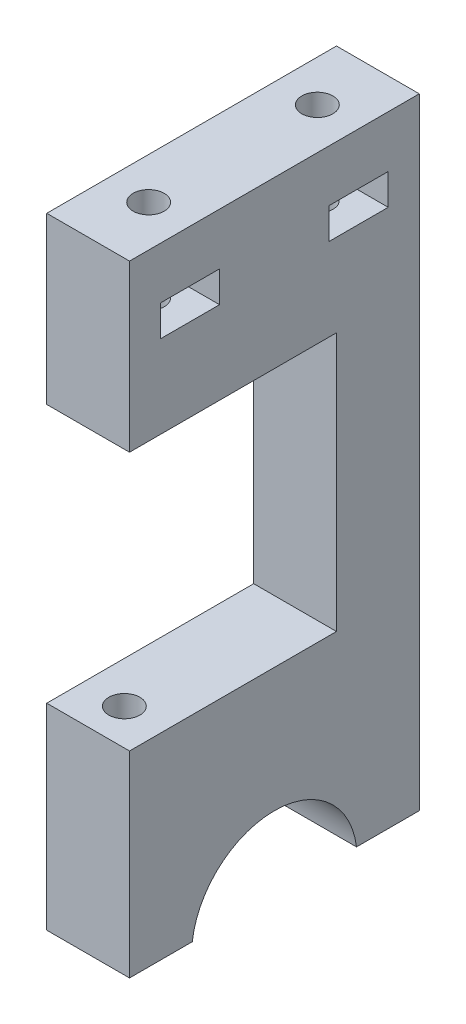
ISO-10303-21;
HEADER;
FILE_DESCRIPTION(('STEP AP214'),'2;1');
FILE_NAME('part.step','',(''),(''),'','','');
FILE_SCHEMA(('AUTOMOTIVE_DESIGN { 1 0 10303 214 1 1 1 1 }'));
ENDSEC;
DATA;
#1=APPLICATION_CONTEXT('core data for automotive mechanical design processes');
#2=APPLICATION_PROTOCOL_DEFINITION('international standard','automotive_design',2000,#1);
#3=PRODUCT_CONTEXT('',#1,'mechanical');
#4=PRODUCT('Part','Part','',(#3));
#5=PRODUCT_RELATED_PRODUCT_CATEGORY('part','',(#4));
#6=PRODUCT_DEFINITION_FORMATION('','',#4);
#7=PRODUCT_DEFINITION_CONTEXT('part definition',#1,'design');
#8=PRODUCT_DEFINITION('design','',#6,#7);
#9=PRODUCT_DEFINITION_SHAPE('','',#8);
#10=(LENGTH_UNIT() NAMED_UNIT(*) SI_UNIT(.MILLI.,.METRE.));
#11=(NAMED_UNIT(*) PLANE_ANGLE_UNIT() SI_UNIT($,.RADIAN.));
#12=(NAMED_UNIT(*) SI_UNIT($,.STERADIAN.) SOLID_ANGLE_UNIT());
#13=UNCERTAINTY_MEASURE_WITH_UNIT(LENGTH_MEASURE(1.E-05),#10,'distance_accuracy_value','');
#14=(GEOMETRIC_REPRESENTATION_CONTEXT(3) GLOBAL_UNCERTAINTY_ASSIGNED_CONTEXT((#13)) GLOBAL_UNIT_ASSIGNED_CONTEXT((#10,
#11,#12)) REPRESENTATION_CONTEXT('',''));
#15=CARTESIAN_POINT('',(0.,0.,0.));
#16=DIRECTION('',(0.,0.,1.));
#17=DIRECTION('',(1.,0.,0.));
#18=AXIS2_PLACEMENT_3D('',#15,#16,#17);
#19=CARTESIAN_POINT('',(1.99999999999999,60.,6.15044247787611));
#20=DIRECTION('',(0.,0.,-1.));
#21=DIRECTION('',(-1.,0.,0.));
#22=AXIS2_PLACEMENT_3D('',#19,#20,#21);
#23=PLANE('',#22);
#24=DIRECTION('',(0.,-1.,0.));
#25=VECTOR('',#24,1.);
#26=CARTESIAN_POINT('',(1.99999999999999,60.,6.15044247787611));
#27=LINE('',#26,#25);
#28=CARTESIAN_POINT('',(1.99999999999999,60.,6.15044247787611));
#29=VERTEX_POINT('',#28);
#30=CARTESIAN_POINT('',(1.99999999999999,44.,6.15044247787611));
#31=VERTEX_POINT('',#30);
#32=EDGE_CURVE('E11',#29,#31,#27,.T.);
#33=ORIENTED_EDGE('',*,*,#32,.T.);
#34=DIRECTION('',(1.,0.,0.));
#35=VECTOR('',#34,1.);
#36=CARTESIAN_POINT('',(1.99999999999999,44.,6.15044247787611));
#37=LINE('',#36,#35);
#38=CARTESIAN_POINT('',(9.99999999999999,44.,6.15044247787611));
#39=VERTEX_POINT('',#38);
#40=EDGE_CURVE('E198',#31,#39,#37,.T.);
#41=ORIENTED_EDGE('',*,*,#40,.T.);
#42=DIRECTION('',(0.,-1.,0.));
#43=VECTOR('',#42,1.);
#44=CARTESIAN_POINT('',(9.99999999999999,60.,6.15044247787611));
#45=LINE('',#44,#43);
#46=CARTESIAN_POINT('',(9.99999999999999,60.,6.15044247787611));
#47=VERTEX_POINT('',#46);
#48=EDGE_CURVE('E182',#47,#39,#45,.T.);
#49=ORIENTED_EDGE('',*,*,#48,.F.);
#50=DIRECTION('',(1.,0.,0.));
#51=VECTOR('',#50,1.);
#52=CARTESIAN_POINT('',(1.99999999999999,60.,6.15044247787611));
#53=LINE('',#52,#51);
#54=EDGE_CURVE('E306',#29,#47,#53,.T.);
#55=ORIENTED_EDGE('',*,*,#54,.F.);
#56=EDGE_LOOP('',(#33,#41,#49,#55));
#57=FACE_BOUND('',#56,.T.);
#58=ADVANCED_FACE('F33',(#57),#23,.F.);
#59=CARTESIAN_POINT('',(0.,0.,0.));
#60=DIRECTION('',(0.,1.,0.));
#61=DIRECTION('',(0.,0.,1.));
#62=AXIS2_PLACEMENT_3D('',#59,#60,#61);
#63=PLANE('',#62);
#64=CARTESIAN_POINT('',(5.99999999999999,0.,2.65044247787611));
#65=DIRECTION('',(0.,-1.,0.));
#66=DIRECTION('',(0.,0.,-1.));
#67=AXIS2_PLACEMENT_3D('',#64,#65,#66);
#68=CIRCLE('',#67,1.5);
#69=CARTESIAN_POINT('',(5.99999999999999,0.,1.15044247787611));
#70=VERTEX_POINT('',#69);
#71=EDGE_CURVE('E279',#70,#70,#68,.T.);
#72=ORIENTED_EDGE('',*,*,#71,.F.);
#73=EDGE_LOOP('',(#72));
#74=FACE_BOUND('',#73,.T.);
#75=DIRECTION('',(0.,0.,1.));
#76=VECTOR('',#75,1.);
#77=CARTESIAN_POINT('',(1.99999999999999,0.,-21.8495575221239));
#78=LINE('',#77,#76);
#79=CARTESIAN_POINT('',(1.99999999999999,0.,0.0876964110698811));
#80=VERTEX_POINT('',#79);
#81=CARTESIAN_POINT('',(1.99999999999999,0.,6.15044247787611));
#82=VERTEX_POINT('',#81);
#83=EDGE_CURVE('E180',#80,#82,#78,.T.);
#84=ORIENTED_EDGE('',*,*,#83,.F.);
#85=DIRECTION('',(1.,0.,0.));
#86=VECTOR('',#85,1.);
#87=CARTESIAN_POINT('',(1.99999999999999,0.,0.0876964110698811));
#88=LINE('',#87,#86);
#89=CARTESIAN_POINT('',(9.99999999999999,0.,0.0876964110698806));
#90=VERTEX_POINT('',#89);
#91=EDGE_CURVE('E297',#80,#90,#88,.T.);
#92=ORIENTED_EDGE('',*,*,#91,.T.);
#93=DIRECTION('',(0.,0.,-1.));
#94=VECTOR('',#93,1.);
#95=CARTESIAN_POINT('',(9.99999999999999,0.,-21.8495575221239));
#96=LINE('',#95,#94);
#97=CARTESIAN_POINT('',(9.99999999999999,0.,6.15044247787611));
#98=VERTEX_POINT('',#97);
#99=EDGE_CURVE('E320',#98,#90,#96,.T.);
#100=ORIENTED_EDGE('',*,*,#99,.F.);
#101=DIRECTION('',(1.,0.,0.));
#102=VECTOR('',#101,1.);
#103=CARTESIAN_POINT('',(1.99999999999999,0.,6.15044247787611));
#104=LINE('',#103,#102);
#105=EDGE_CURVE('E317',#82,#98,#104,.T.);
#106=ORIENTED_EDGE('',*,*,#105,.F.);
#107=EDGE_LOOP('',(#84,#92,#100,#106));
#108=FACE_BOUND('',#107,.T.);
#109=ADVANCED_FACE('F338',(#74,#108),#63,.F.);
#110=CARTESIAN_POINT('',(1.99999999999999,60.,-21.8495575221239));
#111=DIRECTION('',(1.,0.,0.));
#112=DIRECTION('',(0.,0.,-1.));
#113=AXIS2_PLACEMENT_3D('',#110,#111,#112);
#114=PLANE('',#113);
#115=DIRECTION('',(0.,0.,1.));
#116=VECTOR('',#115,1.);
#117=CARTESIAN_POINT('',(1.99999999999999,52.,-2.54955752212389));
#118=LINE('',#117,#116);
#119=CARTESIAN_POINT('',(1.99999999999999,52.,-2.54955752212389));
#120=VERTEX_POINT('',#119);
#121=CARTESIAN_POINT('',(1.99999999999999,52.,3.15044247787611));
#122=VERTEX_POINT('',#121);
#123=EDGE_CURVE('E238',#120,#122,#118,.T.);
#124=ORIENTED_EDGE('',*,*,#123,.F.);
#125=DIRECTION('',(0.,-1.,0.));
#126=VECTOR('',#125,1.);
#127=CARTESIAN_POINT('',(1.99999999999999,52.,-2.54955752212389));
#128=LINE('',#127,#126);
#129=CARTESIAN_POINT('',(1.99999999999999,55.,-2.54955752212389));
#130=VERTEX_POINT('',#129);
#131=EDGE_CURVE('E58',#130,#120,#128,.T.);
#132=ORIENTED_EDGE('',*,*,#131,.F.);
#133=DIRECTION('',(0.,0.,-1.));
#134=VECTOR('',#133,1.);
#135=CARTESIAN_POINT('',(1.99999999999999,55.,-2.54955752212389));
#136=LINE('',#135,#134);
#137=CARTESIAN_POINT('',(1.99999999999999,55.,3.15044247787611));
#138=VERTEX_POINT('',#137);
#139=EDGE_CURVE('E227',#138,#130,#136,.T.);
#140=ORIENTED_EDGE('',*,*,#139,.F.);
#141=DIRECTION('',(0.,1.,0.));
#142=VECTOR('',#141,1.);
#143=CARTESIAN_POINT('',(1.99999999999999,52.,3.15044247787611));
#144=LINE('',#143,#142);
#145=EDGE_CURVE('E241',#122,#138,#144,.T.);
#146=ORIENTED_EDGE('',*,*,#145,.F.);
#147=EDGE_LOOP('',(#124,#132,#140,#146));
#148=FACE_BOUND('',#147,.T.);
#149=DIRECTION('',(0.,0.,1.));
#150=VECTOR('',#149,1.);
#151=CARTESIAN_POINT('',(1.99999999999999,52.,-18.8495575221239));
#152=LINE('',#151,#150);
#153=CARTESIAN_POINT('',(1.99999999999999,52.,-18.8495575221239));
#154=VERTEX_POINT('',#153);
#155=CARTESIAN_POINT('',(1.99999999999999,52.,-13.1495575221239));
#156=VERTEX_POINT('',#155);
#157=EDGE_CURVE('E269',#154,#156,#152,.T.);
#158=ORIENTED_EDGE('',*,*,#157,.F.);
#159=DIRECTION('',(0.,-1.,0.));
#160=VECTOR('',#159,1.);
#161=CARTESIAN_POINT('',(1.99999999999999,52.,-18.8495575221239));
#162=LINE('',#161,#160);
#163=CARTESIAN_POINT('',(1.99999999999999,55.,-18.8495575221239));
#164=VERTEX_POINT('',#163);
#165=EDGE_CURVE('E248',#164,#154,#162,.T.);
#166=ORIENTED_EDGE('',*,*,#165,.F.);
#167=DIRECTION('',(0.,0.,-1.));
#168=VECTOR('',#167,1.);
#169=CARTESIAN_POINT('',(1.99999999999999,55.,-18.8495575221239));
#170=LINE('',#169,#168);
#171=CARTESIAN_POINT('',(1.99999999999999,55.,-13.1495575221239));
#172=VERTEX_POINT('',#171);
#173=EDGE_CURVE('E258',#172,#164,#170,.T.);
#174=ORIENTED_EDGE('',*,*,#173,.F.);
#175=DIRECTION('',(0.,1.,0.));
#176=VECTOR('',#175,1.);
#177=CARTESIAN_POINT('',(1.99999999999999,52.,-13.1495575221239));
#178=LINE('',#177,#176);
#179=EDGE_CURVE('E272',#156,#172,#178,.T.);
#180=ORIENTED_EDGE('',*,*,#179,.F.);
#181=EDGE_LOOP('',(#158,#166,#174,#180));
#182=FACE_BOUND('',#181,.T.);
#183=DIRECTION('',(0.,1.,0.));
#184=VECTOR('',#183,1.);
#185=CARTESIAN_POINT('',(1.99999999999999,44.,-13.8495575221239));
#186=LINE('',#185,#184);
#187=CARTESIAN_POINT('',(1.99999999999999,19.,-13.8495575221239));
#188=VERTEX_POINT('',#187);
#189=CARTESIAN_POINT('',(1.99999999999999,44.,-13.8495575221239));
#190=VERTEX_POINT('',#189);
#191=EDGE_CURVE('E167',#188,#190,#186,.T.);
#192=ORIENTED_EDGE('',*,*,#191,.T.);
#193=DIRECTION('',(0.,0.,1.));
#194=VECTOR('',#193,1.);
#195=CARTESIAN_POINT('',(1.99999999999999,44.,6.15044247787611));
#196=LINE('',#195,#194);
#197=EDGE_CURVE('E176',#190,#31,#196,.T.);
#198=ORIENTED_EDGE('',*,*,#197,.T.);
#199=ORIENTED_EDGE('',*,*,#32,.F.);
#200=DIRECTION('',(0.,0.,1.));
#201=VECTOR('',#200,1.);
#202=CARTESIAN_POINT('',(1.99999999999999,60.,-21.8495575221239));
#203=LINE('',#202,#201);
#204=CARTESIAN_POINT('',(1.99999999999999,60.,-21.8495575221239));
#205=VERTEX_POINT('',#204);
#206=EDGE_CURVE('E303',#205,#29,#203,.T.);
#207=ORIENTED_EDGE('',*,*,#206,.F.);
#208=DIRECTION('',(0.,-1.,0.));
#209=VECTOR('',#208,1.);
#210=CARTESIAN_POINT('',(1.99999999999999,60.,-21.8495575221239));
#211=LINE('',#210,#209);
#212=CARTESIAN_POINT('',(1.99999999999999,0.,-21.8495575221239));
#213=VERTEX_POINT('',#212);
#214=EDGE_CURVE('E313',#205,#213,#211,.T.);
#215=ORIENTED_EDGE('',*,*,#214,.T.);
#216=CARTESIAN_POINT('',(1.99999999999999,0.,-15.7868114553177));
#217=VERTEX_POINT('',#216);
#218=EDGE_CURVE('E314',#213,#217,#78,.T.);
#219=ORIENTED_EDGE('',*,*,#218,.T.);
#220=CARTESIAN_POINT('',(1.99999999999999,-1.,-7.84955752212389));
#221=DIRECTION('',(1.,0.,0.));
#222=DIRECTION('',(0.,0.,-1.));
#223=AXIS2_PLACEMENT_3D('',#220,#221,#222);
#224=CIRCLE('',#223,8.);
#225=EDGE_CURVE('E295',#217,#80,#224,.T.);
#226=ORIENTED_EDGE('',*,*,#225,.T.);
#227=ORIENTED_EDGE('',*,*,#83,.T.);
#228=CARTESIAN_POINT('',(1.99999999999999,19.,6.1504424778761));
#229=VERTEX_POINT('',#228);
#230=EDGE_CURVE('E42',#229,#82,#27,.T.);
#231=ORIENTED_EDGE('',*,*,#230,.F.);
#232=DIRECTION('',(0.,0.,-1.));
#233=VECTOR('',#232,1.);
#234=CARTESIAN_POINT('',(1.99999999999999,19.,6.1504424778761));
#235=LINE('',#234,#233);
#236=EDGE_CURVE('E159',#229,#188,#235,.T.);
#237=ORIENTED_EDGE('',*,*,#236,.T.);
#238=EDGE_LOOP('',(#192,#198,#199,#207,#215,#219,#226,#227,#231,#237));
#239=FACE_BOUND('',#238,.T.);
#240=ADVANCED_FACE('F35',(#148,#182,#239),#114,.F.);
#241=CARTESIAN_POINT('',(9.99999999999999,19.,6.15044247787611));
#242=VERTEX_POINT('',#241);
#243=EDGE_CURVE('E175',#242,#98,#45,.T.);
#244=ORIENTED_EDGE('',*,*,#243,.F.);
#245=DIRECTION('',(1.,0.,0.));
#246=VECTOR('',#245,1.);
#247=CARTESIAN_POINT('',(1.99999999999999,19.,6.1504424778761));
#248=LINE('',#247,#246);
#249=EDGE_CURVE('E50',#229,#242,#248,.T.);
#250=ORIENTED_EDGE('',*,*,#249,.F.);
#251=ORIENTED_EDGE('',*,*,#230,.T.);
#252=ORIENTED_EDGE('',*,*,#105,.T.);
#253=EDGE_LOOP('',(#244,#250,#251,#252));
#254=FACE_BOUND('',#253,.T.);
#255=ADVANCED_FACE('F172',(#254),#23,.F.);
#256=CARTESIAN_POINT('',(9.99999999999999,60.,-21.8495575221239));
#257=DIRECTION('',(-1.,0.,0.));
#258=DIRECTION('',(0.,0.,1.));
#259=AXIS2_PLACEMENT_3D('',#256,#257,#258);
#260=PLANE('',#259);
#261=DIRECTION('',(0.,0.,-1.));
#262=VECTOR('',#261,1.);
#263=CARTESIAN_POINT('',(10.,55.,-2.5495575221239));
#264=LINE('',#263,#262);
#265=CARTESIAN_POINT('',(10.,55.,3.1504424778761));
#266=VERTEX_POINT('',#265);
#267=CARTESIAN_POINT('',(10.,55.,-2.5495575221239));
#268=VERTEX_POINT('',#267);
#269=EDGE_CURVE('E233',#266,#268,#264,.T.);
#270=ORIENTED_EDGE('',*,*,#269,.T.);
#271=DIRECTION('',(0.,-1.,0.));
#272=VECTOR('',#271,1.);
#273=CARTESIAN_POINT('',(10.,52.,-2.5495575221239));
#274=LINE('',#273,#272);
#275=CARTESIAN_POINT('',(10.,52.,-2.5495575221239));
#276=VERTEX_POINT('',#275);
#277=EDGE_CURVE('E223',#268,#276,#274,.T.);
#278=ORIENTED_EDGE('',*,*,#277,.T.);
#279=DIRECTION('',(0.,0.,1.));
#280=VECTOR('',#279,1.);
#281=CARTESIAN_POINT('',(10.,52.,-2.5495575221239));
#282=LINE('',#281,#280);
#283=CARTESIAN_POINT('',(9.99999999999999,52.,3.15044247787611));
#284=VERTEX_POINT('',#283);
#285=EDGE_CURVE('E226',#276,#284,#282,.T.);
#286=ORIENTED_EDGE('',*,*,#285,.T.);
#287=DIRECTION('',(0.,1.,0.));
#288=VECTOR('',#287,1.);
#289=CARTESIAN_POINT('',(10.,52.,3.1504424778761));
#290=LINE('',#289,#288);
#291=EDGE_CURVE('E230',#284,#266,#290,.T.);
#292=ORIENTED_EDGE('',*,*,#291,.T.);
#293=EDGE_LOOP('',(#270,#278,#286,#292));
#294=FACE_BOUND('',#293,.T.);
#295=DIRECTION('',(0.,0.,-1.));
#296=VECTOR('',#295,1.);
#297=CARTESIAN_POINT('',(9.99999999999999,55.,-18.8495575221239));
#298=LINE('',#297,#296);
#299=CARTESIAN_POINT('',(9.99999999999999,55.,-13.1495575221239));
#300=VERTEX_POINT('',#299);
#301=CARTESIAN_POINT('',(9.99999999999999,55.,-18.8495575221239));
#302=VERTEX_POINT('',#301);
#303=EDGE_CURVE('E264',#300,#302,#298,.T.);
#304=ORIENTED_EDGE('',*,*,#303,.T.);
#305=DIRECTION('',(0.,-1.,0.));
#306=VECTOR('',#305,1.);
#307=CARTESIAN_POINT('',(9.99999999999999,52.,-18.8495575221239));
#308=LINE('',#307,#306);
#309=CARTESIAN_POINT('',(9.99999999999999,52.,-18.8495575221239));
#310=VERTEX_POINT('',#309);
#311=EDGE_CURVE('E254',#302,#310,#308,.T.);
#312=ORIENTED_EDGE('',*,*,#311,.T.);
#313=DIRECTION('',(0.,0.,1.));
#314=VECTOR('',#313,1.);
#315=CARTESIAN_POINT('',(9.99999999999999,52.,-18.8495575221239));
#316=LINE('',#315,#314);
#317=CARTESIAN_POINT('',(9.99999999999999,52.,-13.1495575221239));
#318=VERTEX_POINT('',#317);
#319=EDGE_CURVE('E257',#310,#318,#316,.T.);
#320=ORIENTED_EDGE('',*,*,#319,.T.);
#321=DIRECTION('',(0.,1.,0.));
#322=VECTOR('',#321,1.);
#323=CARTESIAN_POINT('',(9.99999999999999,52.,-13.1495575221239));
#324=LINE('',#323,#322);
#325=EDGE_CURVE('E261',#318,#300,#324,.T.);
#326=ORIENTED_EDGE('',*,*,#325,.T.);
#327=EDGE_LOOP('',(#304,#312,#320,#326));
#328=FACE_BOUND('',#327,.T.);
#329=ORIENTED_EDGE('',*,*,#48,.T.);
#330=DIRECTION('',(0.,0.,1.));
#331=VECTOR('',#330,1.);
#332=CARTESIAN_POINT('',(9.99999999999999,44.,6.15044247787611));
#333=LINE('',#332,#331);
#334=CARTESIAN_POINT('',(9.99999999999999,44.,-13.8495575221239));
#335=VERTEX_POINT('',#334);
#336=EDGE_CURVE('E168',#335,#39,#333,.T.);
#337=ORIENTED_EDGE('',*,*,#336,.F.);
#338=DIRECTION('',(0.,1.,0.));
#339=VECTOR('',#338,1.);
#340=CARTESIAN_POINT('',(9.99999999999999,44.,-13.8495575221239));
#341=LINE('',#340,#339);
#342=CARTESIAN_POINT('',(9.99999999999999,19.,-13.8495575221239));
#343=VERTEX_POINT('',#342);
#344=EDGE_CURVE('E355',#343,#335,#341,.T.);
#345=ORIENTED_EDGE('',*,*,#344,.F.);
#346=DIRECTION('',(0.,0.,-1.));
#347=VECTOR('',#346,1.);
#348=CARTESIAN_POINT('',(9.99999999999999,19.,6.1504424778761));
#349=LINE('',#348,#347);
#350=EDGE_CURVE('E336',#242,#343,#349,.T.);
#351=ORIENTED_EDGE('',*,*,#350,.F.);
#352=ORIENTED_EDGE('',*,*,#243,.T.);
#353=ORIENTED_EDGE('',*,*,#99,.T.);
#354=CARTESIAN_POINT('',(9.99999999999999,-1.,-7.84955752212389));
#355=DIRECTION('',(1.,0.,0.));
#356=DIRECTION('',(0.,0.,-1.));
#357=AXIS2_PLACEMENT_3D('',#354,#355,#356);
#358=CIRCLE('',#357,8.);
#359=CARTESIAN_POINT('',(9.99999999999999,0.,-15.7868114553177));
#360=VERTEX_POINT('',#359);
#361=EDGE_CURVE('E292',#360,#90,#358,.T.);
#362=ORIENTED_EDGE('',*,*,#361,.F.);
#363=CARTESIAN_POINT('',(9.99999999999999,0.,-21.8495575221239));
#364=VERTEX_POINT('',#363);
#365=EDGE_CURVE('E319',#360,#364,#96,.T.);
#366=ORIENTED_EDGE('',*,*,#365,.T.);
#367=DIRECTION('',(0.,-1.,0.));
#368=VECTOR('',#367,1.);
#369=CARTESIAN_POINT('',(9.99999999999999,60.,-21.8495575221239));
#370=LINE('',#369,#368);
#371=CARTESIAN_POINT('',(9.99999999999999,60.,-21.8495575221239));
#372=VERTEX_POINT('',#371);
#373=EDGE_CURVE('E325',#372,#364,#370,.T.);
#374=ORIENTED_EDGE('',*,*,#373,.F.);
#375=DIRECTION('',(0.,0.,-1.));
#376=VECTOR('',#375,1.);
#377=CARTESIAN_POINT('',(9.99999999999999,60.,-21.8495575221239));
#378=LINE('',#377,#376);
#379=EDGE_CURVE('E309',#47,#372,#378,.T.);
#380=ORIENTED_EDGE('',*,*,#379,.F.);
#381=EDGE_LOOP('',(#329,#337,#345,#351,#352,#353,#362,#366,#374,#380));
#382=FACE_BOUND('',#381,.T.);
#383=ADVANCED_FACE('F332',(#294,#328,#382),#260,.F.);
#384=CARTESIAN_POINT('',(1.99999999999999,60.,-21.8495575221239));
#385=DIRECTION('',(0.,0.,1.));
#386=DIRECTION('',(1.,0.,0.));
#387=AXIS2_PLACEMENT_3D('',#384,#385,#386);
#388=PLANE('',#387);
#389=DIRECTION('',(-1.,0.,0.));
#390=VECTOR('',#389,1.);
#391=CARTESIAN_POINT('',(1.99999999999999,0.,-21.8495575221239));
#392=LINE('',#391,#390);
#393=EDGE_CURVE('E307',#364,#213,#392,.T.);
#394=ORIENTED_EDGE('',*,*,#393,.T.);
#395=ORIENTED_EDGE('',*,*,#214,.F.);
#396=DIRECTION('',(-1.,0.,0.));
#397=VECTOR('',#396,1.);
#398=CARTESIAN_POINT('',(1.99999999999999,60.,-21.8495575221239));
#399=LINE('',#398,#397);
#400=EDGE_CURVE('E311',#372,#205,#399,.T.);
#401=ORIENTED_EDGE('',*,*,#400,.F.);
#402=ORIENTED_EDGE('',*,*,#373,.T.);
#403=EDGE_LOOP('',(#394,#395,#401,#402));
#404=FACE_BOUND('',#403,.T.);
#405=ADVANCED_FACE('F349',(#404),#388,.F.);
#406=CARTESIAN_POINT('',(0.,60.,0.));
#407=DIRECTION('',(0.,1.,0.));
#408=DIRECTION('',(0.,0.,1.));
#409=AXIS2_PLACEMENT_3D('',#406,#407,#408);
#410=PLANE('',#409);
#411=CARTESIAN_POINT('',(5.99999999999999,60.,0.300442477876107));
#412=DIRECTION('',(0.,1.,0.));
#413=DIRECTION('',(0.,0.,1.));
#414=AXIS2_PLACEMENT_3D('',#411,#412,#413);
#415=CIRCLE('',#414,1.5);
#416=CARTESIAN_POINT('',(5.99999999999999,60.,1.80044247787611));
#417=VERTEX_POINT('',#416);
#418=EDGE_CURVE('E195',#417,#417,#415,.T.);
#419=ORIENTED_EDGE('',*,*,#418,.F.);
#420=EDGE_LOOP('',(#419));
#421=FACE_BOUND('',#420,.T.);
#422=CARTESIAN_POINT('',(5.99999999999999,60.,-15.9995575221239));
#423=DIRECTION('',(0.,1.,0.));
#424=DIRECTION('',(0.,0.,1.));
#425=AXIS2_PLACEMENT_3D('',#422,#423,#424);
#426=CIRCLE('',#425,1.5);
#427=CARTESIAN_POINT('',(5.99999999999999,60.,-14.4995575221239));
#428=VERTEX_POINT('',#427);
#429=EDGE_CURVE('E216',#428,#428,#426,.T.);
#430=ORIENTED_EDGE('',*,*,#429,.F.);
#431=EDGE_LOOP('',(#430));
#432=FACE_BOUND('',#431,.T.);
#433=ORIENTED_EDGE('',*,*,#206,.T.);
#434=ORIENTED_EDGE('',*,*,#54,.T.);
#435=ORIENTED_EDGE('',*,*,#379,.T.);
#436=ORIENTED_EDGE('',*,*,#400,.T.);
#437=EDGE_LOOP('',(#433,#434,#435,#436));
#438=FACE_BOUND('',#437,.T.);
#439=ADVANCED_FACE('F351',(#421,#432,#438),#410,.T.);
#440=CARTESIAN_POINT('',(5.99999999999999,0.,-18.3495575221239));
#441=DIRECTION('',(0.,-1.,0.));
#442=DIRECTION('',(0.,0.,-1.));
#443=AXIS2_PLACEMENT_3D('',#440,#441,#442);
#444=CIRCLE('',#443,1.5);
#445=CARTESIAN_POINT('',(5.99999999999999,0.,-19.8495575221239));
#446=VERTEX_POINT('',#445);
#447=EDGE_CURVE('E288',#446,#446,#444,.T.);
#448=ORIENTED_EDGE('',*,*,#447,.F.);
#449=EDGE_LOOP('',(#448));
#450=FACE_BOUND('',#449,.T.);
#451=ORIENTED_EDGE('',*,*,#365,.F.);
#452=DIRECTION('',(1.,0.,0.));
#453=VECTOR('',#452,1.);
#454=CARTESIAN_POINT('',(1.99999999999999,0.,-15.7868114553177));
#455=LINE('',#454,#453);
#456=EDGE_CURVE('E299',#217,#360,#455,.T.);
#457=ORIENTED_EDGE('',*,*,#456,.F.);
#458=ORIENTED_EDGE('',*,*,#218,.F.);
#459=ORIENTED_EDGE('',*,*,#393,.F.);
#460=EDGE_LOOP('',(#451,#457,#458,#459));
#461=FACE_BOUND('',#460,.T.);
#462=ADVANCED_FACE('F347',(#450,#461),#63,.F.);
#463=CARTESIAN_POINT('',(1.99999999999999,-1.,-7.84955752212389));
#464=DIRECTION('',(1.,0.,0.));
#465=DIRECTION('',(0.,0.,-1.));
#466=AXIS2_PLACEMENT_3D('',#463,#464,#465);
#467=CYLINDRICAL_SURFACE('',#466,8.);
#468=ORIENTED_EDGE('',*,*,#361,.T.);
#469=ORIENTED_EDGE('',*,*,#91,.F.);
#470=ORIENTED_EDGE('',*,*,#225,.F.);
#471=ORIENTED_EDGE('',*,*,#456,.T.);
#472=EDGE_LOOP('',(#468,#469,#470,#471));
#473=FACE_BOUND('',#472,.T.);
#474=ADVANCED_FACE('F340',(#473),#467,.F.);
#475=CARTESIAN_POINT('',(5.99999999999999,25.,-18.3495575221239));
#476=DIRECTION('',(0.,-1.,0.));
#477=DIRECTION('',(0.,0.,-1.));
#478=AXIS2_PLACEMENT_3D('',#475,#476,#477);
#479=CYLINDRICAL_SURFACE('',#478,1.5);
#480=CARTESIAN_POINT('',(5.99999999999999,25.,-18.3495575221239));
#481=DIRECTION('',(0.,-1.,0.));
#482=DIRECTION('',(0.,0.,-1.));
#483=AXIS2_PLACEMENT_3D('',#480,#481,#482);
#484=CIRCLE('',#483,1.5);
#485=CARTESIAN_POINT('',(5.99999999999999,25.,-19.8495575221239));
#486=VERTEX_POINT('',#485);
#487=EDGE_CURVE('E289',#486,#486,#484,.T.);
#488=ORIENTED_EDGE('',*,*,#487,.F.);
#489=EDGE_LOOP('',(#488));
#490=FACE_BOUND('',#489,.T.);
#491=ORIENTED_EDGE('',*,*,#447,.T.);
#492=EDGE_LOOP('',(#491));
#493=FACE_BOUND('',#492,.T.);
#494=ADVANCED_FACE('F434',(#490,#493),#479,.F.);
#495=CARTESIAN_POINT('',(5.99999999999999,25.,-18.3495575221239));
#496=DIRECTION('',(0.,-1.,0.));
#497=DIRECTION('',(0.,0.,-1.));
#498=AXIS2_PLACEMENT_3D('',#495,#496,#497);
#499=PLANE('',#498);
#500=ORIENTED_EDGE('',*,*,#487,.T.);
#501=EDGE_LOOP('',(#500));
#502=FACE_BOUND('',#501,.T.);
#503=ADVANCED_FACE('F430',(#502),#499,.T.);
#504=CARTESIAN_POINT('',(5.99999999999999,25.,2.65044247787611));
#505=DIRECTION('',(0.,-1.,0.));
#506=DIRECTION('',(0.,0.,-1.));
#507=AXIS2_PLACEMENT_3D('',#504,#505,#506);
#508=CYLINDRICAL_SURFACE('',#507,1.5);
#509=CARTESIAN_POINT('',(5.99999999999999,19.,2.65044247787611));
#510=DIRECTION('',(0.,-1.,0.));
#511=DIRECTION('',(0.,0.,-1.));
#512=AXIS2_PLACEMENT_3D('',#509,#510,#511);
#513=CIRCLE('',#512,1.5);
#514=CARTESIAN_POINT('',(5.99999999999999,19.,1.15044247787611));
#515=VERTEX_POINT('',#514);
#516=EDGE_CURVE('E37',#515,#515,#513,.F.);
#517=ORIENTED_EDGE('',*,*,#516,.T.);
#518=EDGE_LOOP('',(#517));
#519=FACE_BOUND('',#518,.T.);
#520=ORIENTED_EDGE('',*,*,#71,.T.);
#521=EDGE_LOOP('',(#520));
#522=FACE_BOUND('',#521,.T.);
#523=ADVANCED_FACE('F427',(#519,#522),#508,.F.);
#524=CARTESIAN_POINT('',(9.99999999999999,52.,-18.8495575221239));
#525=DIRECTION('',(0.,0.,-1.));
#526=DIRECTION('',(-1.,0.,0.));
#527=AXIS2_PLACEMENT_3D('',#524,#525,#526);
#528=PLANE('',#527);
#529=ORIENTED_EDGE('',*,*,#165,.T.);
#530=DIRECTION('',(-1.,0.,0.));
#531=VECTOR('',#530,1.);
#532=CARTESIAN_POINT('',(9.99999999999999,52.,-18.8495575221239));
#533=LINE('',#532,#531);
#534=EDGE_CURVE('E267',#310,#154,#533,.T.);
#535=ORIENTED_EDGE('',*,*,#534,.F.);
#536=ORIENTED_EDGE('',*,*,#311,.F.);
#537=DIRECTION('',(-1.,0.,0.));
#538=VECTOR('',#537,1.);
#539=CARTESIAN_POINT('',(9.99999999999999,55.,-18.8495575221239));
#540=LINE('',#539,#538);
#541=EDGE_CURVE('E277',#302,#164,#540,.T.);
#542=ORIENTED_EDGE('',*,*,#541,.T.);
#543=EDGE_LOOP('',(#529,#535,#536,#542));
#544=FACE_BOUND('',#543,.T.);
#545=ADVANCED_FACE('F405',(#544),#528,.F.);
#546=CARTESIAN_POINT('',(9.99999999999999,55.,-18.8495575221239));
#547=DIRECTION('',(0.,1.,0.));
#548=DIRECTION('',(0.,0.,1.));
#549=AXIS2_PLACEMENT_3D('',#546,#547,#548);
#550=PLANE('',#549);
#551=CARTESIAN_POINT('',(5.99999999999999,55.,-15.9995575221239));
#552=DIRECTION('',(0.,1.,0.));
#553=DIRECTION('',(0.,0.,1.));
#554=AXIS2_PLACEMENT_3D('',#551,#552,#553);
#555=CIRCLE('',#554,1.5);
#556=CARTESIAN_POINT('',(5.99999999999999,55.,-14.4995575221239));
#557=VERTEX_POINT('',#556);
#558=EDGE_CURVE('E190',#557,#557,#555,.T.);
#559=ORIENTED_EDGE('',*,*,#558,.T.);
#560=EDGE_LOOP('',(#559));
#561=FACE_BOUND('',#560,.T.);
#562=ORIENTED_EDGE('',*,*,#173,.T.);
#563=ORIENTED_EDGE('',*,*,#541,.F.);
#564=ORIENTED_EDGE('',*,*,#303,.F.);
#565=DIRECTION('',(-1.,0.,0.));
#566=VECTOR('',#565,1.);
#567=CARTESIAN_POINT('',(9.99999999999999,55.,-13.1495575221239));
#568=LINE('',#567,#566);
#569=EDGE_CURVE('E280',#300,#172,#568,.T.);
#570=ORIENTED_EDGE('',*,*,#569,.T.);
#571=EDGE_LOOP('',(#562,#563,#564,#570));
#572=FACE_BOUND('',#571,.T.);
#573=ADVANCED_FACE('F408',(#561,#572),#550,.F.);
#574=CARTESIAN_POINT('',(9.99999999999999,52.,-13.1495575221239));
#575=DIRECTION('',(0.,0.,1.));
#576=DIRECTION('',(1.,0.,0.));
#577=AXIS2_PLACEMENT_3D('',#574,#575,#576);
#578=PLANE('',#577);
#579=ORIENTED_EDGE('',*,*,#179,.T.);
#580=ORIENTED_EDGE('',*,*,#569,.F.);
#581=ORIENTED_EDGE('',*,*,#325,.F.);
#582=DIRECTION('',(-1.,0.,0.));
#583=VECTOR('',#582,1.);
#584=CARTESIAN_POINT('',(9.99999999999999,52.,-13.1495575221239));
#585=LINE('',#584,#583);
#586=EDGE_CURVE('E282',#318,#156,#585,.T.);
#587=ORIENTED_EDGE('',*,*,#586,.T.);
#588=EDGE_LOOP('',(#579,#580,#581,#587));
#589=FACE_BOUND('',#588,.T.);
#590=ADVANCED_FACE('F410',(#589),#578,.F.);
#591=CARTESIAN_POINT('',(9.99999999999999,52.,-18.8495575221239));
#592=DIRECTION('',(0.,-1.,0.));
#593=DIRECTION('',(0.,0.,-1.));
#594=AXIS2_PLACEMENT_3D('',#591,#592,#593);
#595=PLANE('',#594);
#596=CARTESIAN_POINT('',(5.99999999999999,52.,-15.9995575221239));
#597=DIRECTION('',(0.,-1.,0.));
#598=DIRECTION('',(0.,0.,-1.));
#599=AXIS2_PLACEMENT_3D('',#596,#597,#598);
#600=CIRCLE('',#599,1.5);
#601=CARTESIAN_POINT('',(5.99999999999999,52.,-17.4995575221239));
#602=VERTEX_POINT('',#601);
#603=EDGE_CURVE('E187',#602,#602,#600,.T.);
#604=ORIENTED_EDGE('',*,*,#603,.T.);
#605=EDGE_LOOP('',(#604));
#606=FACE_BOUND('',#605,.T.);
#607=ORIENTED_EDGE('',*,*,#157,.T.);
#608=ORIENTED_EDGE('',*,*,#586,.F.);
#609=ORIENTED_EDGE('',*,*,#319,.F.);
#610=ORIENTED_EDGE('',*,*,#534,.T.);
#611=EDGE_LOOP('',(#607,#608,#609,#610));
#612=FACE_BOUND('',#611,.T.);
#613=ADVANCED_FACE('F401',(#606,#612),#595,.F.);
#614=CARTESIAN_POINT('',(10.,52.,-2.5495575221239));
#615=DIRECTION('',(0.,0.,-1.));
#616=DIRECTION('',(-1.,0.,0.));
#617=AXIS2_PLACEMENT_3D('',#614,#615,#616);
#618=PLANE('',#617);
#619=ORIENTED_EDGE('',*,*,#131,.T.);
#620=DIRECTION('',(-1.,0.,0.));
#621=VECTOR('',#620,1.);
#622=CARTESIAN_POINT('',(10.,52.,-2.5495575221239));
#623=LINE('',#622,#621);
#624=EDGE_CURVE('E236',#276,#120,#623,.T.);
#625=ORIENTED_EDGE('',*,*,#624,.F.);
#626=ORIENTED_EDGE('',*,*,#277,.F.);
#627=DIRECTION('',(-1.,0.,0.));
#628=VECTOR('',#627,1.);
#629=CARTESIAN_POINT('',(10.,55.,-2.5495575221239));
#630=LINE('',#629,#628);
#631=EDGE_CURVE('E246',#268,#130,#630,.T.);
#632=ORIENTED_EDGE('',*,*,#631,.T.);
#633=EDGE_LOOP('',(#619,#625,#626,#632));
#634=FACE_BOUND('',#633,.T.);
#635=ADVANCED_FACE('F418',(#634),#618,.F.);
#636=CARTESIAN_POINT('',(10.,55.,-2.5495575221239));
#637=DIRECTION('',(0.,1.,0.));
#638=DIRECTION('',(0.,0.,1.));
#639=AXIS2_PLACEMENT_3D('',#636,#637,#638);
#640=PLANE('',#639);
#641=CARTESIAN_POINT('',(5.99999999999999,55.,0.300442477876107));
#642=DIRECTION('',(0.,1.,0.));
#643=DIRECTION('',(0.,0.,1.));
#644=AXIS2_PLACEMENT_3D('',#641,#642,#643);
#645=CIRCLE('',#644,1.5);
#646=CARTESIAN_POINT('',(5.99999999999999,55.,1.80044247787611));
#647=VERTEX_POINT('',#646);
#648=EDGE_CURVE('E194',#647,#647,#645,.T.);
#649=ORIENTED_EDGE('',*,*,#648,.T.);
#650=EDGE_LOOP('',(#649));
#651=FACE_BOUND('',#650,.T.);
#652=ORIENTED_EDGE('',*,*,#139,.T.);
#653=ORIENTED_EDGE('',*,*,#631,.F.);
#654=ORIENTED_EDGE('',*,*,#269,.F.);
#655=DIRECTION('',(-1.,0.,0.));
#656=VECTOR('',#655,1.);
#657=CARTESIAN_POINT('',(10.,55.,3.1504424778761));
#658=LINE('',#657,#656);
#659=EDGE_CURVE('E249',#266,#138,#658,.T.);
#660=ORIENTED_EDGE('',*,*,#659,.T.);
#661=EDGE_LOOP('',(#652,#653,#654,#660));
#662=FACE_BOUND('',#661,.T.);
#663=ADVANCED_FACE('F503',(#651,#662),#640,.F.);
#664=CARTESIAN_POINT('',(10.,52.,3.1504424778761));
#665=DIRECTION('',(0.,0.,1.));
#666=DIRECTION('',(1.,0.,0.));
#667=AXIS2_PLACEMENT_3D('',#664,#665,#666);
#668=PLANE('',#667);
#669=ORIENTED_EDGE('',*,*,#145,.T.);
#670=ORIENTED_EDGE('',*,*,#659,.F.);
#671=ORIENTED_EDGE('',*,*,#291,.F.);
#672=DIRECTION('',(-1.,0.,0.));
#673=VECTOR('',#672,1.);
#674=CARTESIAN_POINT('',(10.,52.,3.1504424778761));
#675=LINE('',#674,#673);
#676=EDGE_CURVE('E251',#284,#122,#675,.T.);
#677=ORIENTED_EDGE('',*,*,#676,.T.);
#678=EDGE_LOOP('',(#669,#670,#671,#677));
#679=FACE_BOUND('',#678,.T.);
#680=ADVANCED_FACE('F508',(#679),#668,.F.);
#681=CARTESIAN_POINT('',(10.,52.,-2.5495575221239));
#682=DIRECTION('',(0.,-1.,0.));
#683=DIRECTION('',(0.,0.,-1.));
#684=AXIS2_PLACEMENT_3D('',#681,#682,#683);
#685=PLANE('',#684);
#686=CARTESIAN_POINT('',(5.99999999999999,52.,0.300442477876107));
#687=DIRECTION('',(0.,-1.,0.));
#688=DIRECTION('',(0.,0.,-1.));
#689=AXIS2_PLACEMENT_3D('',#686,#687,#688);
#690=CIRCLE('',#689,1.5);
#691=CARTESIAN_POINT('',(5.99999999999999,52.,-1.19955752212389));
#692=VERTEX_POINT('',#691);
#693=EDGE_CURVE('E192',#692,#692,#690,.T.);
#694=ORIENTED_EDGE('',*,*,#693,.T.);
#695=EDGE_LOOP('',(#694));
#696=FACE_BOUND('',#695,.T.);
#697=ORIENTED_EDGE('',*,*,#123,.T.);
#698=ORIENTED_EDGE('',*,*,#676,.F.);
#699=ORIENTED_EDGE('',*,*,#285,.F.);
#700=ORIENTED_EDGE('',*,*,#624,.T.);
#701=EDGE_LOOP('',(#697,#698,#699,#700));
#702=FACE_BOUND('',#701,.T.);
#703=ADVANCED_FACE('F516',(#696,#702),#685,.F.);
#704=CARTESIAN_POINT('',(5.99999999999999,35.,-15.9995575221239));
#705=DIRECTION('',(0.,1.,0.));
#706=DIRECTION('',(0.,0.,1.));
#707=AXIS2_PLACEMENT_3D('',#704,#705,#706);
#708=PLANE('',#707);
#709=CARTESIAN_POINT('',(5.99999999999999,35.,-15.9995575221239));
#710=DIRECTION('',(0.,1.,0.));
#711=DIRECTION('',(0.,0.,1.));
#712=AXIS2_PLACEMENT_3D('',#709,#710,#711);
#713=CIRCLE('',#712,1.5);
#714=CARTESIAN_POINT('',(5.99999999999999,35.,-14.4995575221239));
#715=VERTEX_POINT('',#714);
#716=EDGE_CURVE('E191',#715,#715,#713,.T.);
#717=ORIENTED_EDGE('',*,*,#716,.T.);
#718=EDGE_LOOP('',(#717));
#719=FACE_BOUND('',#718,.T.);
#720=ADVANCED_FACE('F521',(#719),#708,.T.);
#721=CARTESIAN_POINT('',(5.99999999999999,35.,-15.9995575221239));
#722=DIRECTION('',(0.,1.,0.));
#723=DIRECTION('',(0.,0.,1.));
#724=AXIS2_PLACEMENT_3D('',#721,#722,#723);
#725=CYLINDRICAL_SURFACE('',#724,1.5);
#726=ORIENTED_EDGE('',*,*,#716,.F.);
#727=EDGE_LOOP('',(#726));
#728=FACE_BOUND('',#727,.T.);
#729=ORIENTED_EDGE('',*,*,#603,.F.);
#730=EDGE_LOOP('',(#729));
#731=FACE_BOUND('',#730,.T.);
#732=ADVANCED_FACE('F531',(#728,#731),#725,.F.);
#733=ORIENTED_EDGE('',*,*,#429,.T.);
#734=EDGE_LOOP('',(#733));
#735=FACE_BOUND('',#734,.T.);
#736=ORIENTED_EDGE('',*,*,#558,.F.);
#737=EDGE_LOOP('',(#736));
#738=FACE_BOUND('',#737,.T.);
#739=ADVANCED_FACE('F541',(#735,#738),#725,.F.);
#740=CARTESIAN_POINT('',(5.99999999999999,35.,0.300442477876107));
#741=DIRECTION('',(0.,1.,0.));
#742=DIRECTION('',(0.,0.,1.));
#743=AXIS2_PLACEMENT_3D('',#740,#741,#742);
#744=CYLINDRICAL_SURFACE('',#743,1.5);
#745=CARTESIAN_POINT('',(5.99999999999999,44.,0.300442477876107));
#746=DIRECTION('',(0.,1.,0.));
#747=DIRECTION('',(0.,0.,1.));
#748=AXIS2_PLACEMENT_3D('',#745,#746,#747);
#749=CIRCLE('',#748,1.5);
#750=CARTESIAN_POINT('',(5.99999999999999,44.,1.80044247787611));
#751=VERTEX_POINT('',#750);
#752=EDGE_CURVE('E196',#751,#751,#749,.F.);
#753=ORIENTED_EDGE('',*,*,#752,.T.);
#754=EDGE_LOOP('',(#753));
#755=FACE_BOUND('',#754,.T.);
#756=ORIENTED_EDGE('',*,*,#693,.F.);
#757=EDGE_LOOP('',(#756));
#758=FACE_BOUND('',#757,.T.);
#759=ADVANCED_FACE('F550',(#755,#758),#744,.F.);
#760=ORIENTED_EDGE('',*,*,#418,.T.);
#761=EDGE_LOOP('',(#760));
#762=FACE_BOUND('',#761,.T.);
#763=ORIENTED_EDGE('',*,*,#648,.F.);
#764=EDGE_LOOP('',(#763));
#765=FACE_BOUND('',#764,.T.);
#766=ADVANCED_FACE('F373',(#762,#765),#744,.F.);
#767=CARTESIAN_POINT('',(1.99999999999999,19.,6.1504424778761));
#768=DIRECTION('',(0.,-1.,0.));
#769=DIRECTION('',(0.,0.,-1.));
#770=AXIS2_PLACEMENT_3D('',#767,#768,#769);
#771=PLANE('',#770);
#772=ORIENTED_EDGE('',*,*,#350,.T.);
#773=DIRECTION('',(1.,0.,0.));
#774=VECTOR('',#773,1.);
#775=CARTESIAN_POINT('',(1.99999999999999,19.,-13.8495575221239));
#776=LINE('',#775,#774);
#777=EDGE_CURVE('E162',#188,#343,#776,.T.);
#778=ORIENTED_EDGE('',*,*,#777,.F.);
#779=ORIENTED_EDGE('',*,*,#236,.F.);
#780=ORIENTED_EDGE('',*,*,#249,.T.);
#781=EDGE_LOOP('',(#772,#778,#779,#780));
#782=FACE_BOUND('',#781,.T.);
#783=ORIENTED_EDGE('',*,*,#516,.F.);
#784=EDGE_LOOP('',(#783));
#785=FACE_BOUND('',#784,.T.);
#786=ADVANCED_FACE('F160',(#782,#785),#771,.F.);
#787=CARTESIAN_POINT('',(1.99999999999999,44.,6.15044247787611));
#788=DIRECTION('',(0.,1.,0.));
#789=DIRECTION('',(0.,0.,1.));
#790=AXIS2_PLACEMENT_3D('',#787,#788,#789);
#791=PLANE('',#790);
#792=ORIENTED_EDGE('',*,*,#336,.T.);
#793=ORIENTED_EDGE('',*,*,#40,.F.);
#794=ORIENTED_EDGE('',*,*,#197,.F.);
#795=DIRECTION('',(1.,0.,0.));
#796=VECTOR('',#795,1.);
#797=CARTESIAN_POINT('',(1.99999999999999,44.,-13.8495575221239));
#798=LINE('',#797,#796);
#799=EDGE_CURVE('E203',#190,#335,#798,.T.);
#800=ORIENTED_EDGE('',*,*,#799,.T.);
#801=EDGE_LOOP('',(#792,#793,#794,#800));
#802=FACE_BOUND('',#801,.T.);
#803=ORIENTED_EDGE('',*,*,#752,.F.);
#804=EDGE_LOOP('',(#803));
#805=FACE_BOUND('',#804,.T.);
#806=ADVANCED_FACE('F364',(#802,#805),#791,.F.);
#807=CARTESIAN_POINT('',(1.99999999999999,44.,-13.8495575221239));
#808=DIRECTION('',(0.,0.,-1.));
#809=DIRECTION('',(0.,1.,0.));
#810=AXIS2_PLACEMENT_3D('',#807,#808,#809);
#811=PLANE('',#810);
#812=ORIENTED_EDGE('',*,*,#344,.T.);
#813=ORIENTED_EDGE('',*,*,#799,.F.);
#814=ORIENTED_EDGE('',*,*,#191,.F.);
#815=ORIENTED_EDGE('',*,*,#777,.T.);
#816=EDGE_LOOP('',(#812,#813,#814,#815));
#817=FACE_BOUND('',#816,.T.);
#818=ADVANCED_FACE('F363',(#817),#811,.F.);
#819=CLOSED_SHELL('',(#58,#109,#240,#255,#383,#405,#439,#462,#474,#494,#503,#523,#545,#573,#590,
#613,#635,#663,#680,#703,#720,#732,#739,#759,#766,#786,#806,#818));
#820=MANIFOLD_SOLID_BREP('B2',#819);
#821=ADVANCED_BREP_SHAPE_REPRESENTATION('',(#18,#820),#14);
#822=SHAPE_DEFINITION_REPRESENTATION(#9,#821);
ENDSEC;
END-ISO-10303-21;
